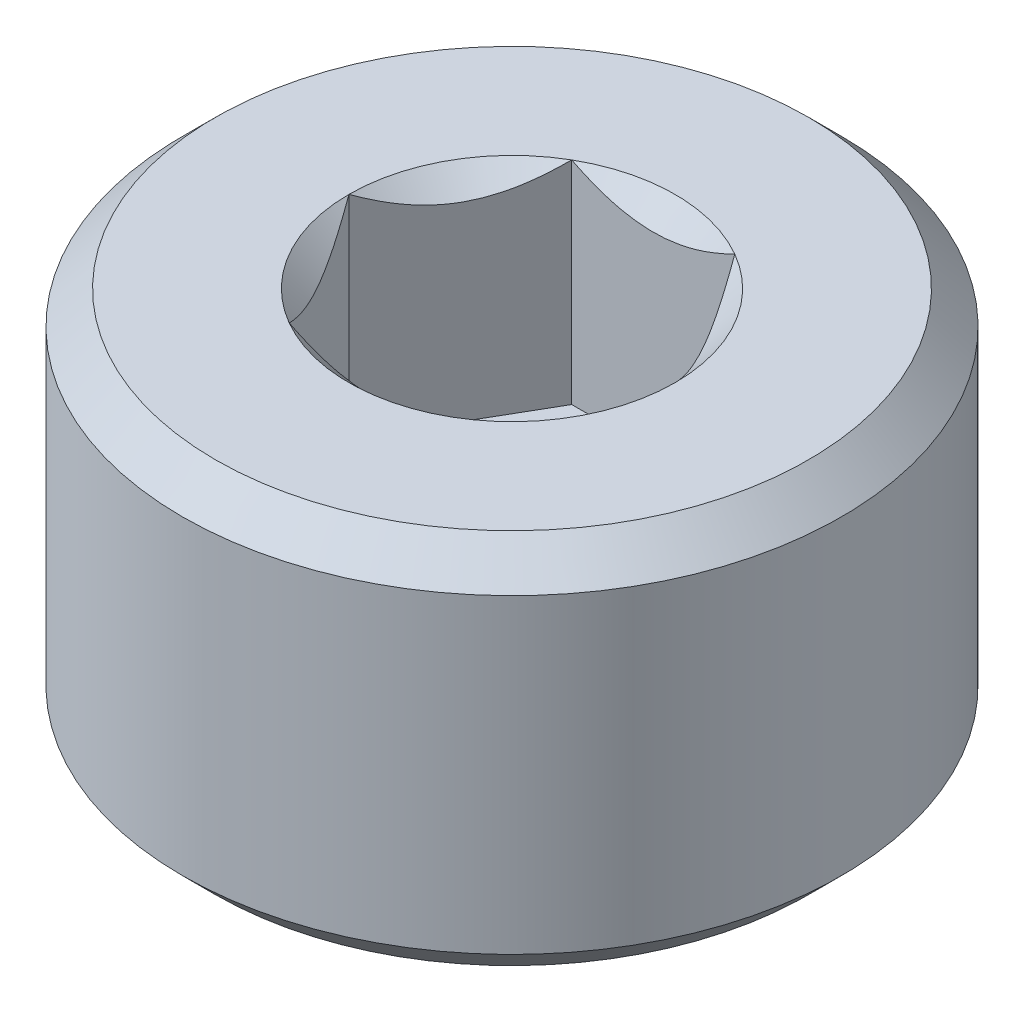
ISO-10303-21;
HEADER;
FILE_DESCRIPTION(('STEP AP214'),'2;1');
FILE_NAME('part.step','',(''),(''),'','','');
FILE_SCHEMA(('AUTOMOTIVE_DESIGN { 1 0 10303 214 1 1 1 1 }'));
ENDSEC;
DATA;
#1=APPLICATION_CONTEXT('core data for automotive mechanical design processes');
#2=APPLICATION_PROTOCOL_DEFINITION('international standard','automotive_design',2000,#1);
#3=PRODUCT_CONTEXT('',#1,'mechanical');
#4=PRODUCT('Part','Part','',(#3));
#5=PRODUCT_RELATED_PRODUCT_CATEGORY('part','',(#4));
#6=PRODUCT_DEFINITION_FORMATION('','',#4);
#7=PRODUCT_DEFINITION_CONTEXT('part definition',#1,'design');
#8=PRODUCT_DEFINITION('design','',#6,#7);
#9=PRODUCT_DEFINITION_SHAPE('','',#8);
#10=(LENGTH_UNIT() NAMED_UNIT(*) SI_UNIT(.MILLI.,.METRE.));
#11=(NAMED_UNIT(*) PLANE_ANGLE_UNIT() SI_UNIT($,.RADIAN.));
#12=(NAMED_UNIT(*) SI_UNIT($,.STERADIAN.) SOLID_ANGLE_UNIT());
#13=UNCERTAINTY_MEASURE_WITH_UNIT(LENGTH_MEASURE(1.E-05),#10,'distance_accuracy_value','');
#14=(GEOMETRIC_REPRESENTATION_CONTEXT(3) GLOBAL_UNCERTAINTY_ASSIGNED_CONTEXT((#13)) GLOBAL_UNIT_ASSIGNED_CONTEXT((#10,
#11,#12)) REPRESENTATION_CONTEXT('',''));
#15=CARTESIAN_POINT('',(0.,0.,0.));
#16=DIRECTION('',(0.,0.,1.));
#17=DIRECTION('',(1.,0.,0.));
#18=AXIS2_PLACEMENT_3D('',#15,#16,#17);
#19=CARTESIAN_POINT('',(0.,4.,0.));
#20=DIRECTION('',(0.,-1.,0.));
#21=DIRECTION('',(0.,0.,-1.));
#22=AXIS2_PLACEMENT_3D('',#19,#20,#21);
#23=CYLINDRICAL_SURFACE('',#22,3.5);
#24=CARTESIAN_POINT('',(0.,0.350000000000001,0.));
#25=DIRECTION('',(0.,1.,0.));
#26=DIRECTION('',(0.,0.,1.));
#27=AXIS2_PLACEMENT_3D('',#24,#25,#26);
#28=CIRCLE('',#27,3.5);
#29=CARTESIAN_POINT('',(0.,0.350000000000001,3.5));
#30=VERTEX_POINT('',#29);
#31=EDGE_CURVE('E216',#30,#30,#28,.T.);
#32=ORIENTED_EDGE('',*,*,#31,.T.);
#33=EDGE_LOOP('',(#32));
#34=FACE_BOUND('',#33,.T.);
#35=CARTESIAN_POINT('',(0.,3.65,0.));
#36=DIRECTION('',(0.,1.,0.));
#37=DIRECTION('',(0.,0.,1.));
#38=AXIS2_PLACEMENT_3D('',#35,#36,#37);
#39=CIRCLE('',#38,3.5);
#40=CARTESIAN_POINT('',(0.,3.65,3.5));
#41=VERTEX_POINT('',#40);
#42=EDGE_CURVE('E104',#41,#41,#39,.F.);
#43=ORIENTED_EDGE('',*,*,#42,.T.);
#44=EDGE_LOOP('',(#43));
#45=FACE_BOUND('',#44,.T.);
#46=ADVANCED_FACE('F33',(#34,#45),#23,.T.);
#47=CARTESIAN_POINT('',(0.,4.,0.));
#48=DIRECTION('',(0.,1.,0.));
#49=DIRECTION('',(0.,0.,1.));
#50=AXIS2_PLACEMENT_3D('',#47,#48,#49);
#51=PLANE('',#50);
#52=CARTESIAN_POINT('',(0.,4.,0.));
#53=DIRECTION('',(0.,1.,0.));
#54=DIRECTION('',(0.,0.,1.));
#55=AXIS2_PLACEMENT_3D('',#52,#53,#54);
#56=CIRCLE('',#55,3.15);
#57=CARTESIAN_POINT('',(0.,4.,3.15));
#58=VERTEX_POINT('',#57);
#59=EDGE_CURVE('E11',#58,#58,#56,.T.);
#60=ORIENTED_EDGE('',*,*,#59,.T.);
#61=EDGE_LOOP('',(#60));
#62=FACE_BOUND('',#61,.T.);
#63=CARTESIAN_POINT('',(0.,4.,0.));
#64=DIRECTION('',(0.,1.,0.));
#65=DIRECTION('',(0.,0.,1.));
#66=AXIS2_PLACEMENT_3D('',#63,#64,#65);
#67=CIRCLE('',#66,1.73205080756888);
#68=CARTESIAN_POINT('',(0.866025403784438,4.,1.5));
#69=VERTEX_POINT('',#68);
#70=CARTESIAN_POINT('',(1.73205080756888,4.,0.));
#71=VERTEX_POINT('',#70);
#72=EDGE_CURVE('E47',#69,#71,#67,.T.);
#73=ORIENTED_EDGE('',*,*,#72,.F.);
#74=CARTESIAN_POINT('',(-0.866025403784438,4.,1.5));
#75=VERTEX_POINT('',#74);
#76=EDGE_CURVE('E54',#75,#69,#67,.T.);
#77=ORIENTED_EDGE('',*,*,#76,.F.);
#78=CARTESIAN_POINT('',(-1.73205080756888,4.,0.));
#79=VERTEX_POINT('',#78);
#80=EDGE_CURVE('E127',#79,#75,#67,.T.);
#81=ORIENTED_EDGE('',*,*,#80,.F.);
#82=CARTESIAN_POINT('',(-0.866025403784439,4.,-1.5));
#83=VERTEX_POINT('',#82);
#84=EDGE_CURVE('E126',#83,#79,#67,.T.);
#85=ORIENTED_EDGE('',*,*,#84,.F.);
#86=CARTESIAN_POINT('',(0.866025403784438,4.,-1.5));
#87=VERTEX_POINT('',#86);
#88=EDGE_CURVE('E94',#87,#83,#67,.T.);
#89=ORIENTED_EDGE('',*,*,#88,.F.);
#90=EDGE_CURVE('E86',#71,#87,#67,.T.);
#91=ORIENTED_EDGE('',*,*,#90,.F.);
#92=EDGE_LOOP('',(#73,#77,#81,#85,#89,#91));
#93=FACE_BOUND('',#92,.T.);
#94=ADVANCED_FACE('F124',(#62,#93),#51,.T.);
#95=CARTESIAN_POINT('',(0.,0.,0.));
#96=DIRECTION('',(0.,1.,0.));
#97=DIRECTION('',(0.,0.,1.));
#98=AXIS2_PLACEMENT_3D('',#95,#96,#97);
#99=PLANE('',#98);
#100=CARTESIAN_POINT('',(0.,0.,0.));
#101=DIRECTION('',(0.,1.,0.));
#102=DIRECTION('',(0.,0.,1.));
#103=AXIS2_PLACEMENT_3D('',#100,#101,#102);
#104=CIRCLE('',#103,3.15);
#105=CARTESIAN_POINT('',(0.,0.,3.15));
#106=VERTEX_POINT('',#105);
#107=EDGE_CURVE('E41',#106,#106,#104,.F.);
#108=ORIENTED_EDGE('',*,*,#107,.T.);
#109=EDGE_LOOP('',(#108));
#110=FACE_BOUND('',#109,.T.);
#111=ADVANCED_FACE('F198',(#110),#99,.F.);
#112=CARTESIAN_POINT('',(0.,4.,0.));
#113=DIRECTION('',(0.,1.,0.));
#114=DIRECTION('',(0.,0.,1.));
#115=AXIS2_PLACEMENT_3D('',#112,#113,#114);
#116=CONICAL_SURFACE('',#115,1.73205080756888,0.78539816339745);
#117=ORIENTED_EDGE('',*,*,#88,.T.);
#118=CARTESIAN_POINT('',(-1.72720812969692,4.55557851627079,-1.5));
#119=CARTESIAN_POINT('',(-1.68515175699268,4.52382990785743,-1.5));
#120=CARTESIAN_POINT('',(-1.64286104748673,4.49239259380738,-1.5));
#121=CARTESIAN_POINT('',(-1.55771581035942,4.43026908755641,-1.5));
#122=CARTESIAN_POINT('',(-1.51486114386668,4.3995830858922,-1.5));
#123=CARTESIAN_POINT('',(-1.3846813415127,4.30840719242716,-1.5));
#124=CARTESIAN_POINT('',(-1.29637976071654,4.24928834342677,-1.5));
#125=CARTESIAN_POINT('',(-1.11121478730467,4.1332309963165,-1.5));
#126=CARTESIAN_POINT('',(-1.01415038238167,4.07660955873301,-1.5));
#127=CARTESIAN_POINT('',(-0.815173408897606,3.97303688126565,-1.5));
#128=CARTESIAN_POINT('',(-0.713278669253285,3.92605304154167,-1.5));
#129=CARTESIAN_POINT('',(-0.560333774943112,3.86857266843083,-1.5));
#130=CARTESIAN_POINT('',(-0.511547982948042,3.85207538775725,-1.5));
#131=CARTESIAN_POINT('',(-0.412798620136866,3.822997512927,-1.5));
#132=CARTESIAN_POINT('',(-0.362834968437563,3.81041718859402,-1.5));
#133=CARTESIAN_POINT('',(-0.262863235444982,3.79003619414677,-1.5));
#134=CARTESIAN_POINT('',(-0.212872113808023,3.78215363274598,-1.5));
#135=CARTESIAN_POINT('',(-0.112355243569545,3.771322063969,-1.5));
#136=CARTESIAN_POINT('',(-0.0618295883726279,3.76837220852435,-1.5));
#137=CARTESIAN_POINT('',(0.037429173332384,3.76762485772485,-1.5));
#138=CARTESIAN_POINT('',(0.0861609672002989,3.76964473355808,-1.5));
#139=CARTESIAN_POINT('',(0.183206937768827,3.77832255289676,-1.5));
#140=CARTESIAN_POINT('',(0.231521073438269,3.78498094696846,-1.5));
#141=CARTESIAN_POINT('',(0.328199853425436,3.80268524412257,-1.5));
#142=CARTESIAN_POINT('',(0.376550616310328,3.81380581125704,-1.5));
#143=CARTESIAN_POINT('',(0.472195697125598,3.83984341404871,-1.5));
#144=CARTESIAN_POINT('',(0.51949010309274,3.85476013204094,-1.5));
#145=CARTESIAN_POINT('',(0.668391282696624,3.90733522359607,-1.5));
#146=CARTESIAN_POINT('',(0.767878709508552,3.95098128747198,-1.5));
#147=CARTESIAN_POINT('',(0.962179866690724,4.0480229945931,-1.5));
#148=CARTESIAN_POINT('',(1.05697519961444,4.10145366508953,-1.5));
#149=CARTESIAN_POINT('',(1.23814273533383,4.21168585200456,-1.5));
#150=CARTESIAN_POINT('',(1.3246994218129,4.2681879206986,-1.5));
#151=CARTESIAN_POINT('',(1.45222331290673,4.35553430157866,-1.5));
#152=CARTESIAN_POINT('',(1.49418091978756,4.38495775868004,-1.5));
#153=CARTESIAN_POINT('',(1.57752272931476,4.44458282183046,-1.5));
#154=CARTESIAN_POINT('',(1.61890708647354,4.47478421166444,-1.5));
#155=CARTESIAN_POINT('',(1.66005278019494,4.50530817860946,-1.5));
#156=B_SPLINE_CURVE_WITH_KNOTS('',3,(#118,#119,#120,#121,#122,#123,#124,#125,#126,#127,#128,
#129,#130,#131,#132,#133,#134,#135,#136,#137,#138,#139,#140,#141,#142,#143,#144,#145,#146,#147,
#148,#149,#150,#151,#152,#153,#154,#155),.UNSPECIFIED.,.F.,.F.,(4,2,2,2,2,2,2,2,2,2,2,2,2,2,2,2,
2,2,4),(0.,0.158079548982669,0.316198780993942,0.634850417346958,0.971690311361509,
1.30737131660667,1.46173961127089,1.61611853740677,1.76772101421409,1.91929742368538,
2.065387412096,2.21149159305544,2.36014984633872,2.50879566386709,2.83376031422673,
3.15991186985652,3.46985601802197,3.62358896039974,3.7772796264207),.UNSPECIFIED.);
#157=EDGE_CURVE('E99',#87,#83,#156,.F.);
#158=ORIENTED_EDGE('',*,*,#157,.F.);
#159=EDGE_LOOP('',(#117,#158));
#160=FACE_BOUND('',#159,.T.);
#161=ADVANCED_FACE('F100',(#160),#116,.F.);
#162=ORIENTED_EDGE('',*,*,#84,.T.);
#163=CARTESIAN_POINT('',(-0.865909933730601,4.00011548160007,-1.5002));
#164=CARTESIAN_POINT('',(-0.895682611594166,3.97036547606733,-1.44863220926292));
#165=CARTESIAN_POINT('',(-0.925953159489765,3.94236248391031,-1.3962020823348));
#166=CARTESIAN_POINT('',(-0.987678321317123,3.89108923044014,-1.2892909659444));
#167=CARTESIAN_POINT('',(-1.01913880822717,3.86784750504437,-1.23479980418534));
#168=CARTESIAN_POINT('',(-1.08257741237344,3.82803372899222,-1.12492091864275));
#169=CARTESIAN_POINT('',(-1.11453936608521,3.8113615856709,-1.0695611909048));
#170=CARTESIAN_POINT('',(-1.1791670593912,3.7856744568181,-0.957622742522849));
#171=CARTESIAN_POINT('',(-1.21183082354213,3.77664029047887,-0.901047443446992));
#172=CARTESIAN_POINT('',(-1.26812411040032,3.76848908122685,-0.803544610483559));
#173=CARTESIAN_POINT('',(-1.29168087824208,3.76728225298922,-0.762743091719534));
#174=CARTESIAN_POINT('',(-1.33875285845138,3.76931405716227,-0.681212030384142));
#175=CARTESIAN_POINT('',(-1.36226806050018,3.77255367074831,-0.64048250568537));
#176=CARTESIAN_POINT('',(-1.40907206156905,3.78329198598196,-0.559415597836584));
#177=CARTESIAN_POINT('',(-1.43236062923612,3.79079465301873,-0.519078615401712));
#178=CARTESIAN_POINT('',(-1.47854689118996,3.80965161192829,-0.439081663085969));
#179=CARTESIAN_POINT('',(-1.50144441326545,3.82100755701858,-0.399421991483792));
#180=CARTESIAN_POINT('',(-1.56009461325633,3.85472164759267,-0.297836865225515));
#181=CARTESIAN_POINT('',(-1.59548353987866,3.87962184909337,-0.236541446290311));
#182=CARTESIAN_POINT('',(-1.64751843074894,3.92165665327158,-0.146414371536686));
#183=CARTESIAN_POINT('',(-1.66466545167617,3.9364251535591,-0.116714860092282));
#184=CARTESIAN_POINT('',(-1.69864410935691,3.96731056594017,-0.0578620986162487));
#185=CARTESIAN_POINT('',(-1.71547589206761,3.98342683412171,-0.0287085957793624));
#186=CARTESIAN_POINT('',(-1.73216627762272,4.00011548160007,0.00020000000000028));
#187=B_SPLINE_CURVE_WITH_KNOTS('',3,(#163,#164,#165,#166,#167,#168,#169,#170,#171,#172,#173,
#174,#175,#176,#177,#178,#179,#180,#181,#182,#183,#184,#185,#186),.UNSPECIFIED.,.F.,.F.,(4,2,2,
2,2,2,2,2,2,2,2,4),(0.,0.199829143693304,0.400822987382388,0.598623720538181,0.795926240188889,
0.937113067959881,1.07833105577193,1.21968061668222,1.36109089931054,1.58570969637565,
1.69770705470964,1.80965120737194),.UNSPECIFIED.);
#188=EDGE_CURVE('E129',#83,#79,#187,.T.);
#189=ORIENTED_EDGE('',*,*,#188,.F.);
#190=EDGE_LOOP('',(#162,#189));
#191=FACE_BOUND('',#190,.T.);
#192=ADVANCED_FACE('F227',(#191),#116,.F.);
#193=ORIENTED_EDGE('',*,*,#80,.T.);
#194=CARTESIAN_POINT('',(-1.73216627762272,4.00011548160007,-0.000199999999999694));
#195=CARTESIAN_POINT('',(-1.70239359975915,3.97036547606733,0.051367790737076));
#196=CARTESIAN_POINT('',(-1.67212305186355,3.94236248391031,0.103797917665201));
#197=CARTESIAN_POINT('',(-1.61039789003619,3.89108923044014,0.210709034055597));
#198=CARTESIAN_POINT('',(-1.57893740312614,3.86784750504437,0.265200195814662));
#199=CARTESIAN_POINT('',(-1.51549879897987,3.82803372899222,0.375079081357249));
#200=CARTESIAN_POINT('',(-1.4835368452681,3.8113615856709,0.4304388090952));
#201=CARTESIAN_POINT('',(-1.41890915196211,3.7856744568181,0.542377257477151));
#202=CARTESIAN_POINT('',(-1.38624538781118,3.77664029047887,0.598952556553009));
#203=CARTESIAN_POINT('',(-1.32995210095299,3.76848908122685,0.696455389516441));
#204=CARTESIAN_POINT('',(-1.30639533311124,3.76728225298922,0.737256908280466));
#205=CARTESIAN_POINT('',(-1.25932335290193,3.76931405716227,0.818787969615858));
#206=CARTESIAN_POINT('',(-1.23580815085313,3.77255367074831,0.85951749431463));
#207=CARTESIAN_POINT('',(-1.18900414978427,3.78329198598196,0.940584402163416));
#208=CARTESIAN_POINT('',(-1.1657155821172,3.79079465301873,0.980921384598288));
#209=CARTESIAN_POINT('',(-1.11952932016335,3.80965161192829,1.06091833691403));
#210=CARTESIAN_POINT('',(-1.09663179808786,3.82100755701859,1.10057800851621));
#211=CARTESIAN_POINT('',(-1.03798159809698,3.85472164759267,1.20216313477448));
#212=CARTESIAN_POINT('',(-1.00259267147465,3.87962184909337,1.26345855370969));
#213=CARTESIAN_POINT('',(-0.950557780604375,3.92165665327158,1.35358562846331));
#214=CARTESIAN_POINT('',(-0.933410759677147,3.9364251535591,1.38328513990772));
#215=CARTESIAN_POINT('',(-0.899432101996407,3.96731056594017,1.44213790138375));
#216=CARTESIAN_POINT('',(-0.88260031928571,3.98342683412171,1.47129140422064));
#217=CARTESIAN_POINT('',(-0.865909933730601,4.00011548160007,1.5002));
#218=B_SPLINE_CURVE_WITH_KNOTS('',3,(#194,#195,#196,#197,#198,#199,#200,#201,#202,#203,#204,
#205,#206,#207,#208,#209,#210,#211,#212,#213,#214,#215,#216,#217),.UNSPECIFIED.,.F.,.F.,(4,2,2,
2,2,2,2,2,2,2,2,4),(0.,0.199829143693305,0.400822987382389,0.598623720538181,0.795926240188889,
0.937113067959881,1.07833105577193,1.21968061668222,1.36109089931054,1.58570969637565,
1.69770705470964,1.80965120737194),.UNSPECIFIED.);
#219=EDGE_CURVE('E137',#79,#75,#218,.T.);
#220=ORIENTED_EDGE('',*,*,#219,.F.);
#221=EDGE_LOOP('',(#193,#220));
#222=FACE_BOUND('',#221,.T.);
#223=ADVANCED_FACE('F231',(#222),#116,.F.);
#224=ORIENTED_EDGE('',*,*,#76,.T.);
#225=CARTESIAN_POINT('',(-1.72720812994822,4.55557851646053,1.5));
#226=CARTESIAN_POINT('',(-1.68515175723693,4.52382990803985,1.5));
#227=CARTESIAN_POINT('',(-1.64286104772391,4.49239259398251,1.5));
#228=CARTESIAN_POINT('',(-1.55771581058238,4.43026908771699,1.5));
#229=CARTESIAN_POINT('',(-1.51486114408249,4.39958308604553,1.5));
#230=CARTESIAN_POINT('',(-1.38468134170665,4.30840719255859,1.5));
#231=CARTESIAN_POINT('',(-1.29637976089561,4.24928834354366,1.5));
#232=CARTESIAN_POINT('',(-1.11121478745132,4.13323099640349,1.5));
#233=CARTESIAN_POINT('',(-1.01415038251067,4.07660955880473,1.5));
#234=CARTESIAN_POINT('',(-0.815173408989814,3.9730368813091,1.5));
#235=CARTESIAN_POINT('',(-0.71327866932636,3.92605304157206,1.5));
#236=CARTESIAN_POINT('',(-0.56033377500179,3.86857266845154,1.5));
#237=CARTESIAN_POINT('',(-0.511547983012749,3.85207538777834,1.5));
#238=CARTESIAN_POINT('',(-0.412798620213828,3.82299751294763,1.5));
#239=CARTESIAN_POINT('',(-0.362834968520751,3.8104171886138,1.5));
#240=CARTESIAN_POINT('',(-0.262863235540417,3.79003619416346,1.5));
#241=CARTESIAN_POINT('',(-0.212872113909475,3.78215363276045,1.5));
#242=CARTESIAN_POINT('',(-0.112355243682832,3.77132206397768,1.5));
#243=CARTESIAN_POINT('',(-0.061829588491731,3.76837220852945,1.5));
#244=CARTESIAN_POINT('',(0.0374291732025493,3.76762485772178,1.5));
#245=CARTESIAN_POINT('',(0.086160967065534,3.76964473355048,1.5));
#246=CARTESIAN_POINT('',(0.183206937624695,3.77832255287941,1.5));
#247=CARTESIAN_POINT('',(0.2315210732897,3.78498094694588,1.5));
#248=CARTESIAN_POINT('',(0.328199853268108,3.80268524408904,1.5));
#249=CARTESIAN_POINT('',(0.376550616148692,3.81380581121775,1.5));
#250=CARTESIAN_POINT('',(0.47219569695576,3.83984341399777,1.5));
#251=CARTESIAN_POINT('',(0.51949010291901,3.8547601319841,1.5));
#252=CARTESIAN_POINT('',(0.668391282485064,3.90733522351148,1.5));
#253=CARTESIAN_POINT('',(0.767878709264951,3.95098128736184,1.5));
#254=CARTESIAN_POINT('',(0.9621798663855,4.04802299442906,1.5));
#255=CARTESIAN_POINT('',(1.05697519927965,4.10145366489712,1.5));
#256=CARTESIAN_POINT('',(1.23814273494588,4.21168585175783,1.5));
#257=CARTESIAN_POINT('',(1.32469942140117,4.26818792042618,1.5));
#258=CARTESIAN_POINT('',(1.45222331245985,4.35553430126784,1.5));
#259=CARTESIAN_POINT('',(1.49418091932912,4.38495775835653,1.5));
#260=CARTESIAN_POINT('',(1.5775227288333,4.44458282148157,1.5));
#261=CARTESIAN_POINT('',(1.6189070859806,4.47478421130286,1.5));
#262=CARTESIAN_POINT('',(1.66005277969054,4.50530817823521,1.5));
#263=B_SPLINE_CURVE_WITH_KNOTS('',3,(#225,#226,#227,#228,#229,#230,#231,#232,#233,#234,#235,
#236,#237,#238,#239,#240,#241,#242,#243,#244,#245,#246,#247,#248,#249,#250,#251,#252,#253,#254,
#255,#256,#257,#258,#259,#260,#261,#262),.UNSPECIFIED.,.F.,.F.,(4,2,2,2,2,2,2,2,2,2,2,2,2,2,2,2,
2,2,4),(0.,0.158079549012757,0.316198781054129,0.634850417468465,0.971690311551782,
1.30737131686505,1.46173961151184,1.61611853763032,1.76772101442095,1.91929742387554,
2.06538741227089,2.21149159321503,2.36014984648185,2.50879566399376,2.83376031423511,
3.15991186974582,3.4698560178094,3.62358896013692,3.77727962610764),.UNSPECIFIED.);
#264=EDGE_CURVE('E161',#75,#69,#263,.T.);
#265=ORIENTED_EDGE('',*,*,#264,.F.);
#266=EDGE_LOOP('',(#224,#265));
#267=FACE_BOUND('',#266,.T.);
#268=ADVANCED_FACE('F236',(#267),#116,.F.);
#269=ORIENTED_EDGE('',*,*,#72,.T.);
#270=CARTESIAN_POINT('',(0.865909933730601,4.00011548160007,1.5002));
#271=CARTESIAN_POINT('',(0.895682611594166,3.97036547606733,1.44863220926292));
#272=CARTESIAN_POINT('',(0.925953159489765,3.94236248391031,1.3962020823348));
#273=CARTESIAN_POINT('',(0.987678321317124,3.89108923044014,1.2892909659444));
#274=CARTESIAN_POINT('',(1.01913880822717,3.86784750504437,1.23479980418534));
#275=CARTESIAN_POINT('',(1.08257741237344,3.82803372899222,1.12492091864275));
#276=CARTESIAN_POINT('',(1.11453936608521,3.8113615856709,1.0695611909048));
#277=CARTESIAN_POINT('',(1.1791670593912,3.7856744568181,0.95762274252285));
#278=CARTESIAN_POINT('',(1.21183082354213,3.77664029047887,0.901047443446992));
#279=CARTESIAN_POINT('',(1.26812411040032,3.76848908122685,0.80354461048356));
#280=CARTESIAN_POINT('',(1.29168087824208,3.76728225298922,0.762743091719534));
#281=CARTESIAN_POINT('',(1.33875285845138,3.76931405716227,0.681212030384142));
#282=CARTESIAN_POINT('',(1.36226806050018,3.77255367074831,0.640482505685371));
#283=CARTESIAN_POINT('',(1.40907206156905,3.78329198598196,0.559415597836584));
#284=CARTESIAN_POINT('',(1.43236062923612,3.79079465301873,0.519078615401712));
#285=CARTESIAN_POINT('',(1.47854689118996,3.80965161192829,0.43908166308597));
#286=CARTESIAN_POINT('',(1.50144441326545,3.82100755701859,0.399421991483792));
#287=CARTESIAN_POINT('',(1.56009461325633,3.85472164759267,0.297836865225515));
#288=CARTESIAN_POINT('',(1.59548353987866,3.87962184909337,0.236541446290311));
#289=CARTESIAN_POINT('',(1.64751843074894,3.92165665327158,0.146414371536686));
#290=CARTESIAN_POINT('',(1.66466545167617,3.9364251535591,0.116714860092282));
#291=CARTESIAN_POINT('',(1.69864410935691,3.96731056594017,0.0578620986162488));
#292=CARTESIAN_POINT('',(1.71547589206761,3.98342683412171,0.0287085957793626));
#293=CARTESIAN_POINT('',(1.73216627762272,4.00011548160007,-0.000200000000000026));
#294=B_SPLINE_CURVE_WITH_KNOTS('',3,(#270,#271,#272,#273,#274,#275,#276,#277,#278,#279,#280,
#281,#282,#283,#284,#285,#286,#287,#288,#289,#290,#291,#292,#293),.UNSPECIFIED.,.F.,.F.,(4,2,2,
2,2,2,2,2,2,2,2,4),(0.,0.199829143693305,0.400822987382389,0.59862372053818,0.795926240188889,
0.937113067959881,1.07833105577193,1.21968061668222,1.36109089931054,1.58570969637565,
1.69770705470964,1.80965120737194),.UNSPECIFIED.);
#295=EDGE_CURVE('E114',#69,#71,#294,.T.);
#296=ORIENTED_EDGE('',*,*,#295,.F.);
#297=EDGE_LOOP('',(#269,#296));
#298=FACE_BOUND('',#297,.T.);
#299=ADVANCED_FACE('F150',(#298),#116,.F.);
#300=ORIENTED_EDGE('',*,*,#90,.T.);
#301=CARTESIAN_POINT('',(1.73216627762272,4.00011548160007,0.000200000000000282));
#302=CARTESIAN_POINT('',(1.70239359975915,3.97036547606733,-0.0513677907370753));
#303=CARTESIAN_POINT('',(1.67212305186355,3.94236248391031,-0.103797917665201));
#304=CARTESIAN_POINT('',(1.61039789003619,3.89108923044014,-0.210709034055596));
#305=CARTESIAN_POINT('',(1.57893740312614,3.86784750504437,-0.265200195814661));
#306=CARTESIAN_POINT('',(1.51549879897987,3.82803372899222,-0.375079081357248));
#307=CARTESIAN_POINT('',(1.4835368452681,3.8113615856709,-0.430438809095199));
#308=CARTESIAN_POINT('',(1.41890915196211,3.7856744568181,-0.54237725747715));
#309=CARTESIAN_POINT('',(1.38624538781118,3.77664029047887,-0.598952556553008));
#310=CARTESIAN_POINT('',(1.32995210095299,3.76848908122685,-0.69645538951644));
#311=CARTESIAN_POINT('',(1.30639533311124,3.76728225298922,-0.737256908280466));
#312=CARTESIAN_POINT('',(1.25932335290193,3.76931405716227,-0.818787969615858));
#313=CARTESIAN_POINT('',(1.23580815085313,3.77255367074831,-0.85951749431463));
#314=CARTESIAN_POINT('',(1.18900414978427,3.78329198598196,-0.940584402163416));
#315=CARTESIAN_POINT('',(1.1657155821172,3.79079465301873,-0.980921384598288));
#316=CARTESIAN_POINT('',(1.11952932016335,3.80965161192829,-1.06091833691403));
#317=CARTESIAN_POINT('',(1.09663179808786,3.82100755701858,-1.10057800851621));
#318=CARTESIAN_POINT('',(1.03798159809698,3.85472164759267,-1.20216313477448));
#319=CARTESIAN_POINT('',(1.00259267147465,3.87962184909337,-1.26345855370969));
#320=CARTESIAN_POINT('',(0.950557780604375,3.92165665327158,-1.35358562846331));
#321=CARTESIAN_POINT('',(0.933410759677148,3.9364251535591,-1.38328513990772));
#322=CARTESIAN_POINT('',(0.899432101996407,3.96731056594017,-1.44213790138375));
#323=CARTESIAN_POINT('',(0.88260031928571,3.98342683412171,-1.47129140422064));
#324=CARTESIAN_POINT('',(0.865909933730601,4.00011548160007,-1.5002));
#325=B_SPLINE_CURVE_WITH_KNOTS('',3,(#301,#302,#303,#304,#305,#306,#307,#308,#309,#310,#311,
#312,#313,#314,#315,#316,#317,#318,#319,#320,#321,#322,#323,#324),.UNSPECIFIED.,.F.,.F.,(4,2,2,
2,2,2,2,2,2,2,2,4),(0.,0.199829143693305,0.400822987382389,0.598623720538181,0.79592624018889,
0.937113067959881,1.07833105577193,1.21968061668222,1.36109089931054,1.58570969637566,
1.69770705470964,1.80965120737194),.UNSPECIFIED.);
#326=EDGE_CURVE('E90',#71,#87,#325,.T.);
#327=ORIENTED_EDGE('',*,*,#326,.F.);
#328=EDGE_LOOP('',(#300,#327));
#329=FACE_BOUND('',#328,.T.);
#330=ADVANCED_FACE('F88',(#329),#116,.F.);
#331=CARTESIAN_POINT('',(0.,1.75,0.));
#332=DIRECTION('',(0.,1.,0.));
#333=DIRECTION('',(0.,0.,1.));
#334=AXIS2_PLACEMENT_3D('',#331,#332,#333);
#335=PLANE('',#334);
#336=DIRECTION('',(-0.5,0.,-0.866025403784439));
#337=VECTOR('',#336,1.);
#338=CARTESIAN_POINT('',(1.73205080756888,1.75,0.));
#339=LINE('',#338,#337);
#340=CARTESIAN_POINT('',(1.73205080756888,1.75,0.));
#341=VERTEX_POINT('',#340);
#342=CARTESIAN_POINT('',(0.866025403784438,1.75,-1.5));
#343=VERTEX_POINT('',#342);
#344=EDGE_CURVE('E113',#341,#343,#339,.T.);
#345=ORIENTED_EDGE('',*,*,#344,.T.);
#346=DIRECTION('',(-1.,0.,0.));
#347=VECTOR('',#346,1.);
#348=CARTESIAN_POINT('',(0.866025403784438,1.75,-1.5));
#349=LINE('',#348,#347);
#350=CARTESIAN_POINT('',(-0.866025403784439,1.75,-1.5));
#351=VERTEX_POINT('',#350);
#352=EDGE_CURVE('E118',#343,#351,#349,.T.);
#353=ORIENTED_EDGE('',*,*,#352,.T.);
#354=DIRECTION('',(-0.5,0.,0.866025403784439));
#355=VECTOR('',#354,1.);
#356=CARTESIAN_POINT('',(-0.866025403784439,1.75,-1.5));
#357=LINE('',#356,#355);
#358=CARTESIAN_POINT('',(-1.73205080756888,1.75,0.));
#359=VERTEX_POINT('',#358);
#360=EDGE_CURVE('E262',#351,#359,#357,.T.);
#361=ORIENTED_EDGE('',*,*,#360,.T.);
#362=DIRECTION('',(0.5,0.,0.866025403784439));
#363=VECTOR('',#362,1.);
#364=CARTESIAN_POINT('',(-1.73205080756888,1.75,0.));
#365=LINE('',#364,#363);
#366=CARTESIAN_POINT('',(-0.866025403784438,1.75,1.5));
#367=VERTEX_POINT('',#366);
#368=EDGE_CURVE('E245',#359,#367,#365,.T.);
#369=ORIENTED_EDGE('',*,*,#368,.T.);
#370=DIRECTION('',(1.,0.,0.));
#371=VECTOR('',#370,1.);
#372=CARTESIAN_POINT('',(-0.866025403784438,1.75,1.5));
#373=LINE('',#372,#371);
#374=CARTESIAN_POINT('',(0.866025403784439,1.75,1.5));
#375=VERTEX_POINT('',#374);
#376=EDGE_CURVE('E258',#367,#375,#373,.T.);
#377=ORIENTED_EDGE('',*,*,#376,.T.);
#378=DIRECTION('',(0.5,0.,-0.866025403784439));
#379=VECTOR('',#378,1.);
#380=CARTESIAN_POINT('',(0.866025403784439,1.75,1.5));
#381=LINE('',#380,#379);
#382=EDGE_CURVE('E121',#375,#341,#381,.T.);
#383=ORIENTED_EDGE('',*,*,#382,.T.);
#384=EDGE_LOOP('',(#345,#353,#361,#369,#377,#383));
#385=FACE_BOUND('',#384,.T.);
#386=ADVANCED_FACE('F149',(#385),#335,.T.);
#387=CARTESIAN_POINT('',(0.866025403784438,1.75,-1.5));
#388=DIRECTION('',(0.,0.,-1.));
#389=DIRECTION('',(-1.,0.,0.));
#390=AXIS2_PLACEMENT_3D('',#387,#388,#389);
#391=PLANE('',#390);
#392=DIRECTION('',(0.,1.,0.));
#393=VECTOR('',#392,1.);
#394=CARTESIAN_POINT('',(0.866025403784438,1.75,-1.5));
#395=LINE('',#394,#393);
#396=EDGE_CURVE('E111',#343,#87,#395,.T.);
#397=ORIENTED_EDGE('',*,*,#396,.T.);
#398=ORIENTED_EDGE('',*,*,#157,.T.);
#399=DIRECTION('',(0.,1.,0.));
#400=VECTOR('',#399,1.);
#401=CARTESIAN_POINT('',(-0.866025403784439,1.75,-1.5));
#402=LINE('',#401,#400);
#403=EDGE_CURVE('E120',#351,#83,#402,.T.);
#404=ORIENTED_EDGE('',*,*,#403,.F.);
#405=ORIENTED_EDGE('',*,*,#352,.F.);
#406=EDGE_LOOP('',(#397,#398,#404,#405));
#407=FACE_BOUND('',#406,.T.);
#408=ADVANCED_FACE('F116',(#407),#391,.F.);
#409=CARTESIAN_POINT('',(-0.866025403784439,1.75,-1.5));
#410=DIRECTION('',(-0.866025403784439,0.,-0.5));
#411=DIRECTION('',(-0.5,0.,0.866025403784439));
#412=AXIS2_PLACEMENT_3D('',#409,#410,#411);
#413=PLANE('',#412);
#414=ORIENTED_EDGE('',*,*,#403,.T.);
#415=ORIENTED_EDGE('',*,*,#188,.T.);
#416=DIRECTION('',(0.,1.,0.));
#417=VECTOR('',#416,1.);
#418=CARTESIAN_POINT('',(-1.73205080756888,1.75,0.));
#419=LINE('',#418,#417);
#420=EDGE_CURVE('E242',#359,#79,#419,.T.);
#421=ORIENTED_EDGE('',*,*,#420,.F.);
#422=ORIENTED_EDGE('',*,*,#360,.F.);
#423=EDGE_LOOP('',(#414,#415,#421,#422));
#424=FACE_BOUND('',#423,.T.);
#425=ADVANCED_FACE('F143',(#424),#413,.F.);
#426=CARTESIAN_POINT('',(-1.73205080756888,1.75,0.));
#427=DIRECTION('',(-0.866025403784439,0.,0.5));
#428=DIRECTION('',(0.5,0.,0.866025403784439));
#429=AXIS2_PLACEMENT_3D('',#426,#427,#428);
#430=PLANE('',#429);
#431=ORIENTED_EDGE('',*,*,#420,.T.);
#432=ORIENTED_EDGE('',*,*,#219,.T.);
#433=DIRECTION('',(0.,1.,0.));
#434=VECTOR('',#433,1.);
#435=CARTESIAN_POINT('',(-0.866025403784438,1.75,1.5));
#436=LINE('',#435,#434);
#437=EDGE_CURVE('E247',#367,#75,#436,.T.);
#438=ORIENTED_EDGE('',*,*,#437,.F.);
#439=ORIENTED_EDGE('',*,*,#368,.F.);
#440=EDGE_LOOP('',(#431,#432,#438,#439));
#441=FACE_BOUND('',#440,.T.);
#442=ADVANCED_FACE('F182',(#441),#430,.F.);
#443=CARTESIAN_POINT('',(-0.866025403784438,1.75,1.5));
#444=DIRECTION('',(0.,0.,1.));
#445=DIRECTION('',(1.,0.,0.));
#446=AXIS2_PLACEMENT_3D('',#443,#444,#445);
#447=PLANE('',#446);
#448=ORIENTED_EDGE('',*,*,#437,.T.);
#449=ORIENTED_EDGE('',*,*,#264,.T.);
#450=DIRECTION('',(0.,1.,0.));
#451=VECTOR('',#450,1.);
#452=CARTESIAN_POINT('',(0.866025403784439,1.75,1.5));
#453=LINE('',#452,#451);
#454=EDGE_CURVE('E249',#375,#69,#453,.T.);
#455=ORIENTED_EDGE('',*,*,#454,.F.);
#456=ORIENTED_EDGE('',*,*,#376,.F.);
#457=EDGE_LOOP('',(#448,#449,#455,#456));
#458=FACE_BOUND('',#457,.T.);
#459=ADVANCED_FACE('F178',(#458),#447,.F.);
#460=CARTESIAN_POINT('',(0.866025403784439,1.75,1.5));
#461=DIRECTION('',(0.866025403784439,0.,0.5));
#462=DIRECTION('',(0.5,0.,-0.866025403784439));
#463=AXIS2_PLACEMENT_3D('',#460,#461,#462);
#464=PLANE('',#463);
#465=ORIENTED_EDGE('',*,*,#454,.T.);
#466=ORIENTED_EDGE('',*,*,#295,.T.);
#467=DIRECTION('',(0.,1.,0.));
#468=VECTOR('',#467,1.);
#469=CARTESIAN_POINT('',(1.73205080756888,1.75,0.));
#470=LINE('',#469,#468);
#471=EDGE_CURVE('E105',#341,#71,#470,.T.);
#472=ORIENTED_EDGE('',*,*,#471,.F.);
#473=ORIENTED_EDGE('',*,*,#382,.F.);
#474=EDGE_LOOP('',(#465,#466,#472,#473));
#475=FACE_BOUND('',#474,.T.);
#476=ADVANCED_FACE('F175',(#475),#464,.F.);
#477=CARTESIAN_POINT('',(1.73205080756888,1.75,0.));
#478=DIRECTION('',(0.866025403784439,0.,-0.5));
#479=DIRECTION('',(-0.5,0.,-0.866025403784439));
#480=AXIS2_PLACEMENT_3D('',#477,#478,#479);
#481=PLANE('',#480);
#482=ORIENTED_EDGE('',*,*,#471,.T.);
#483=ORIENTED_EDGE('',*,*,#326,.T.);
#484=ORIENTED_EDGE('',*,*,#396,.F.);
#485=ORIENTED_EDGE('',*,*,#344,.F.);
#486=EDGE_LOOP('',(#482,#483,#484,#485));
#487=FACE_BOUND('',#486,.T.);
#488=ADVANCED_FACE('F109',(#487),#481,.F.);
#489=CARTESIAN_POINT('',(0.,0.350000000000001,0.));
#490=DIRECTION('',(0.,1.,0.));
#491=DIRECTION('',(0.,0.,1.));
#492=AXIS2_PLACEMENT_3D('',#489,#490,#491);
#493=CONICAL_SURFACE('',#492,3.5,0.78539816339745);
#494=ORIENTED_EDGE('',*,*,#107,.F.);
#495=EDGE_LOOP('',(#494));
#496=FACE_BOUND('',#495,.T.);
#497=ORIENTED_EDGE('',*,*,#31,.F.);
#498=EDGE_LOOP('',(#497));
#499=FACE_BOUND('',#498,.T.);
#500=ADVANCED_FACE('F204',(#496,#499),#493,.T.);
#501=CARTESIAN_POINT('',(0.,4.,0.));
#502=DIRECTION('',(0.,-1.,0.));
#503=DIRECTION('',(0.,0.,-1.));
#504=AXIS2_PLACEMENT_3D('',#501,#502,#503);
#505=CONICAL_SURFACE('',#504,3.15,0.785398163397448);
#506=ORIENTED_EDGE('',*,*,#42,.F.);
#507=EDGE_LOOP('',(#506));
#508=FACE_BOUND('',#507,.T.);
#509=ORIENTED_EDGE('',*,*,#59,.F.);
#510=EDGE_LOOP('',(#509));
#511=FACE_BOUND('',#510,.T.);
#512=ADVANCED_FACE('F35',(#508,#511),#505,.T.);
#513=CLOSED_SHELL('',(#46,#94,#111,#161,#192,#223,#268,#299,#330,#386,#408,#425,#442,#459,#476,
#488,#500,#512));
#514=MANIFOLD_SOLID_BREP('B2',#513);
#515=ADVANCED_BREP_SHAPE_REPRESENTATION('',(#18,#514),#14);
#516=SHAPE_DEFINITION_REPRESENTATION(#9,#515);
ENDSEC;
END-ISO-10303-21;
